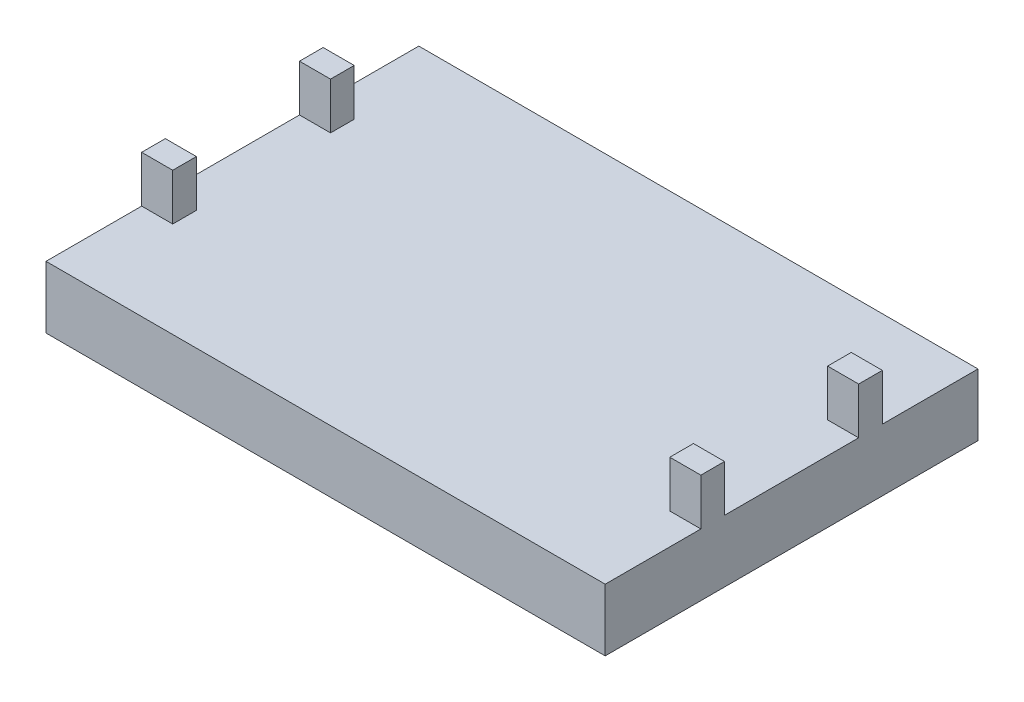
ISO-10303-21;
HEADER;
FILE_DESCRIPTION(('STEP AP214'),'2;1');
FILE_NAME('part.step','',(''),(''),'','','');
FILE_SCHEMA(('AUTOMOTIVE_DESIGN { 1 0 10303 214 1 1 1 1 }'));
ENDSEC;
DATA;
#1=APPLICATION_CONTEXT('core data for automotive mechanical design processes');
#2=APPLICATION_PROTOCOL_DEFINITION('international standard','automotive_design',2000,#1);
#3=PRODUCT_CONTEXT('',#1,'mechanical');
#4=PRODUCT('Part','Part','',(#3));
#5=PRODUCT_RELATED_PRODUCT_CATEGORY('part','',(#4));
#6=PRODUCT_DEFINITION_FORMATION('','',#4);
#7=PRODUCT_DEFINITION_CONTEXT('part definition',#1,'design');
#8=PRODUCT_DEFINITION('design','',#6,#7);
#9=PRODUCT_DEFINITION_SHAPE('','',#8);
#10=(LENGTH_UNIT() NAMED_UNIT(*) SI_UNIT(.MILLI.,.METRE.));
#11=(NAMED_UNIT(*) PLANE_ANGLE_UNIT() SI_UNIT($,.RADIAN.));
#12=(NAMED_UNIT(*) SI_UNIT($,.STERADIAN.) SOLID_ANGLE_UNIT());
#13=UNCERTAINTY_MEASURE_WITH_UNIT(LENGTH_MEASURE(1.E-05),#10,'distance_accuracy_value','');
#14=(GEOMETRIC_REPRESENTATION_CONTEXT(3) GLOBAL_UNCERTAINTY_ASSIGNED_CONTEXT((#13)) GLOBAL_UNIT_ASSIGNED_CONTEXT((#10,
#11,#12)) REPRESENTATION_CONTEXT('',''));
#15=CARTESIAN_POINT('',(0.,0.,0.));
#16=DIRECTION('',(0.,0.,1.));
#17=DIRECTION('',(1.,0.,0.));
#18=AXIS2_PLACEMENT_3D('',#15,#16,#17);
#19=CARTESIAN_POINT('',(0.,10.,0.));
#20=DIRECTION('',(0.,1.,0.));
#21=DIRECTION('',(0.,0.,1.));
#22=AXIS2_PLACEMENT_3D('',#19,#20,#21);
#23=PLANE('',#22);
#24=DIRECTION('',(1.,0.,0.));
#25=VECTOR('',#24,1.);
#26=CARTESIAN_POINT('',(40.,10.,14.605));
#27=LINE('',#26,#25);
#28=CARTESIAN_POINT('',(40.,10.,14.605));
#29=VERTEX_POINT('',#28);
#30=CARTESIAN_POINT('',(45.,10.,14.605));
#31=VERTEX_POINT('',#30);
#32=EDGE_CURVE('E61',#29,#31,#27,.T.);
#33=ORIENTED_EDGE('',*,*,#32,.F.);
#34=DIRECTION('',(0.,0.,-1.));
#35=VECTOR('',#34,1.);
#36=CARTESIAN_POINT('',(40.,10.,0.));
#37=LINE('',#36,#35);
#38=CARTESIAN_POINT('',(40.,10.,10.795));
#39=VERTEX_POINT('',#38);
#40=EDGE_CURVE('E56',#29,#39,#37,.T.);
#41=ORIENTED_EDGE('',*,*,#40,.T.);
#42=DIRECTION('',(1.,0.,0.));
#43=VECTOR('',#42,1.);
#44=CARTESIAN_POINT('',(40.,10.,10.795));
#45=LINE('',#44,#43);
#46=CARTESIAN_POINT('',(45.,10.,10.795));
#47=VERTEX_POINT('',#46);
#48=EDGE_CURVE('E196',#39,#47,#45,.T.);
#49=ORIENTED_EDGE('',*,*,#48,.T.);
#50=DIRECTION('',(0.,0.,-1.));
#51=VECTOR('',#50,1.);
#52=CARTESIAN_POINT('',(45.,10.,30.));
#53=LINE('',#52,#51);
#54=CARTESIAN_POINT('',(45.,10.,-10.795));
#55=VERTEX_POINT('',#54);
#56=EDGE_CURVE('E313',#47,#55,#53,.T.);
#57=ORIENTED_EDGE('',*,*,#56,.T.);
#58=DIRECTION('',(1.,0.,0.));
#59=VECTOR('',#58,1.);
#60=CARTESIAN_POINT('',(40.,10.,-10.795));
#61=LINE('',#60,#59);
#62=CARTESIAN_POINT('',(40.,10.,-10.795));
#63=VERTEX_POINT('',#62);
#64=EDGE_CURVE('E239',#63,#55,#61,.T.);
#65=ORIENTED_EDGE('',*,*,#64,.F.);
#66=DIRECTION('',(0.,0.,-1.));
#67=VECTOR('',#66,1.);
#68=CARTESIAN_POINT('',(40.,10.,0.));
#69=LINE('',#68,#67);
#70=CARTESIAN_POINT('',(40.,10.,-14.605));
#71=VERTEX_POINT('',#70);
#72=EDGE_CURVE('E220',#63,#71,#69,.T.);
#73=ORIENTED_EDGE('',*,*,#72,.T.);
#74=DIRECTION('',(1.,0.,0.));
#75=VECTOR('',#74,1.);
#76=CARTESIAN_POINT('',(40.,10.,-14.605));
#77=LINE('',#76,#75);
#78=CARTESIAN_POINT('',(45.,10.,-14.605));
#79=VERTEX_POINT('',#78);
#80=EDGE_CURVE('E236',#71,#79,#77,.T.);
#81=ORIENTED_EDGE('',*,*,#80,.T.);
#82=CARTESIAN_POINT('',(45.,10.,-30.));
#83=VERTEX_POINT('',#82);
#84=EDGE_CURVE('E309',#79,#83,#53,.T.);
#85=ORIENTED_EDGE('',*,*,#84,.T.);
#86=DIRECTION('',(-1.,0.,0.));
#87=VECTOR('',#86,1.);
#88=CARTESIAN_POINT('',(45.,10.,-30.));
#89=LINE('',#88,#87);
#90=CARTESIAN_POINT('',(-45.,10.,-30.));
#91=VERTEX_POINT('',#90);
#92=EDGE_CURVE('E312',#83,#91,#89,.T.);
#93=ORIENTED_EDGE('',*,*,#92,.T.);
#94=DIRECTION('',(0.,0.,1.));
#95=VECTOR('',#94,1.);
#96=CARTESIAN_POINT('',(-45.,10.,30.));
#97=LINE('',#96,#95);
#98=CARTESIAN_POINT('',(-45.,10.,-14.605));
#99=VERTEX_POINT('',#98);
#100=EDGE_CURVE('E302',#91,#99,#97,.T.);
#101=ORIENTED_EDGE('',*,*,#100,.T.);
#102=DIRECTION('',(-1.,0.,0.));
#103=VECTOR('',#102,1.);
#104=CARTESIAN_POINT('',(-40.,10.,-14.605));
#105=LINE('',#104,#103);
#106=CARTESIAN_POINT('',(-40.,10.,-14.605));
#107=VERTEX_POINT('',#106);
#108=EDGE_CURVE('E299',#107,#99,#105,.T.);
#109=ORIENTED_EDGE('',*,*,#108,.F.);
#110=DIRECTION('',(0.,0.,-1.));
#111=VECTOR('',#110,1.);
#112=CARTESIAN_POINT('',(-40.,10.,0.));
#113=LINE('',#112,#111);
#114=CARTESIAN_POINT('',(-40.,10.,-10.795));
#115=VERTEX_POINT('',#114);
#116=EDGE_CURVE('E281',#115,#107,#113,.T.);
#117=ORIENTED_EDGE('',*,*,#116,.F.);
#118=DIRECTION('',(-1.,0.,0.));
#119=VECTOR('',#118,1.);
#120=CARTESIAN_POINT('',(-40.,10.,-10.795));
#121=LINE('',#120,#119);
#122=CARTESIAN_POINT('',(-45.,10.,-10.795));
#123=VERTEX_POINT('',#122);
#124=EDGE_CURVE('E296',#115,#123,#121,.T.);
#125=ORIENTED_EDGE('',*,*,#124,.T.);
#126=CARTESIAN_POINT('',(-45.,10.,10.795));
#127=VERTEX_POINT('',#126);
#128=EDGE_CURVE('E306',#123,#127,#97,.T.);
#129=ORIENTED_EDGE('',*,*,#128,.T.);
#130=DIRECTION('',(-1.,0.,0.));
#131=VECTOR('',#130,1.);
#132=CARTESIAN_POINT('',(-40.,10.,10.795));
#133=LINE('',#132,#131);
#134=CARTESIAN_POINT('',(-40.,10.,10.795));
#135=VERTEX_POINT('',#134);
#136=EDGE_CURVE('E268',#135,#127,#133,.T.);
#137=ORIENTED_EDGE('',*,*,#136,.F.);
#138=DIRECTION('',(0.,0.,-1.));
#139=VECTOR('',#138,1.);
#140=CARTESIAN_POINT('',(-40.,10.,0.));
#141=LINE('',#140,#139);
#142=CARTESIAN_POINT('',(-40.,10.,14.605));
#143=VERTEX_POINT('',#142);
#144=EDGE_CURVE('E253',#143,#135,#141,.T.);
#145=ORIENTED_EDGE('',*,*,#144,.F.);
#146=DIRECTION('',(-1.,0.,0.));
#147=VECTOR('',#146,1.);
#148=CARTESIAN_POINT('',(-40.,10.,14.605));
#149=LINE('',#148,#147);
#150=CARTESIAN_POINT('',(-45.,10.,14.605));
#151=VERTEX_POINT('',#150);
#152=EDGE_CURVE('E264',#143,#151,#149,.T.);
#153=ORIENTED_EDGE('',*,*,#152,.T.);
#154=CARTESIAN_POINT('',(-45.,10.,30.));
#155=VERTEX_POINT('',#154);
#156=EDGE_CURVE('E307',#151,#155,#97,.T.);
#157=ORIENTED_EDGE('',*,*,#156,.T.);
#158=DIRECTION('',(1.,0.,0.));
#159=VECTOR('',#158,1.);
#160=CARTESIAN_POINT('',(45.,10.,30.));
#161=LINE('',#160,#159);
#162=CARTESIAN_POINT('',(45.,10.,30.));
#163=VERTEX_POINT('',#162);
#164=EDGE_CURVE('E305',#155,#163,#161,.T.);
#165=ORIENTED_EDGE('',*,*,#164,.T.);
#166=EDGE_CURVE('E310',#163,#31,#53,.T.);
#167=ORIENTED_EDGE('',*,*,#166,.T.);
#168=EDGE_LOOP('',(#33,#41,#49,#57,#65,#73,#81,#85,#93,#101,#109,#117,#125,#129,#137,#145,#153,
#157,#165,#167));
#169=FACE_BOUND('',#168,.T.);
#170=ADVANCED_FACE('F41',(#169),#23,.T.);
#171=CARTESIAN_POINT('',(-45.,10.,30.));
#172=DIRECTION('',(1.,0.,0.));
#173=DIRECTION('',(0.,0.,-1.));
#174=AXIS2_PLACEMENT_3D('',#171,#172,#173);
#175=PLANE('',#174);
#176=DIRECTION('',(0.,0.,1.));
#177=VECTOR('',#176,1.);
#178=CARTESIAN_POINT('',(-45.,0.,30.));
#179=LINE('',#178,#177);
#180=CARTESIAN_POINT('',(-45.,0.,-30.));
#181=VERTEX_POINT('',#180);
#182=CARTESIAN_POINT('',(-45.,0.,30.));
#183=VERTEX_POINT('',#182);
#184=EDGE_CURVE('E295',#181,#183,#179,.T.);
#185=ORIENTED_EDGE('',*,*,#184,.T.);
#186=DIRECTION('',(0.,-1.,0.));
#187=VECTOR('',#186,1.);
#188=CARTESIAN_POINT('',(-45.,10.,30.));
#189=LINE('',#188,#187);
#190=EDGE_CURVE('E11',#155,#183,#189,.T.);
#191=ORIENTED_EDGE('',*,*,#190,.F.);
#192=ORIENTED_EDGE('',*,*,#156,.F.);
#193=DIRECTION('',(0.,-1.,0.));
#194=VECTOR('',#193,1.);
#195=CARTESIAN_POINT('',(-45.,0.,14.605));
#196=LINE('',#195,#194);
#197=CARTESIAN_POINT('',(-45.,17.5,14.605));
#198=VERTEX_POINT('',#197);
#199=EDGE_CURVE('E235',#198,#151,#196,.T.);
#200=ORIENTED_EDGE('',*,*,#199,.F.);
#201=DIRECTION('',(0.,0.,-1.));
#202=VECTOR('',#201,1.);
#203=CARTESIAN_POINT('',(-45.,17.5,0.));
#204=LINE('',#203,#202);
#205=CARTESIAN_POINT('',(-45.,17.5,10.795));
#206=VERTEX_POINT('',#205);
#207=EDGE_CURVE('E259',#198,#206,#204,.T.);
#208=ORIENTED_EDGE('',*,*,#207,.T.);
#209=DIRECTION('',(0.,-1.,0.));
#210=VECTOR('',#209,1.);
#211=CARTESIAN_POINT('',(-45.,0.,10.795));
#212=LINE('',#211,#210);
#213=EDGE_CURVE('E247',#206,#127,#212,.T.);
#214=ORIENTED_EDGE('',*,*,#213,.T.);
#215=ORIENTED_EDGE('',*,*,#128,.F.);
#216=DIRECTION('',(0.,-1.,0.));
#217=VECTOR('',#216,1.);
#218=CARTESIAN_POINT('',(-45.,0.,-10.795));
#219=LINE('',#218,#217);
#220=CARTESIAN_POINT('',(-45.,17.5,-10.795));
#221=VERTEX_POINT('',#220);
#222=EDGE_CURVE('E278',#221,#123,#219,.T.);
#223=ORIENTED_EDGE('',*,*,#222,.F.);
#224=DIRECTION('',(0.,0.,1.));
#225=VECTOR('',#224,1.);
#226=CARTESIAN_POINT('',(-45.,17.5,0.));
#227=LINE('',#226,#225);
#228=CARTESIAN_POINT('',(-45.,17.5,-14.605));
#229=VERTEX_POINT('',#228);
#230=EDGE_CURVE('E267',#229,#221,#227,.T.);
#231=ORIENTED_EDGE('',*,*,#230,.F.);
#232=DIRECTION('',(0.,-1.,0.));
#233=VECTOR('',#232,1.);
#234=CARTESIAN_POINT('',(-45.,0.,-14.605));
#235=LINE('',#234,#233);
#236=EDGE_CURVE('E288',#229,#99,#235,.T.);
#237=ORIENTED_EDGE('',*,*,#236,.T.);
#238=ORIENTED_EDGE('',*,*,#100,.F.);
#239=DIRECTION('',(0.,-1.,0.));
#240=VECTOR('',#239,1.);
#241=CARTESIAN_POINT('',(-45.,10.,-30.));
#242=LINE('',#241,#240);
#243=EDGE_CURVE('E315',#91,#181,#242,.T.);
#244=ORIENTED_EDGE('',*,*,#243,.T.);
#245=EDGE_LOOP('',(#185,#191,#192,#200,#208,#214,#215,#223,#231,#237,#238,#244));
#246=FACE_BOUND('',#245,.T.);
#247=ADVANCED_FACE('F43',(#246),#175,.F.);
#248=CARTESIAN_POINT('',(45.,10.,30.));
#249=DIRECTION('',(0.,0.,-1.));
#250=DIRECTION('',(-1.,0.,0.));
#251=AXIS2_PLACEMENT_3D('',#248,#249,#250);
#252=PLANE('',#251);
#253=DIRECTION('',(1.,0.,0.));
#254=VECTOR('',#253,1.);
#255=CARTESIAN_POINT('',(45.,0.,30.));
#256=LINE('',#255,#254);
#257=CARTESIAN_POINT('',(45.,0.,30.));
#258=VERTEX_POINT('',#257);
#259=EDGE_CURVE('E318',#183,#258,#256,.T.);
#260=ORIENTED_EDGE('',*,*,#259,.T.);
#261=DIRECTION('',(0.,-1.,0.));
#262=VECTOR('',#261,1.);
#263=CARTESIAN_POINT('',(45.,10.,30.));
#264=LINE('',#263,#262);
#265=EDGE_CURVE('E49',#163,#258,#264,.T.);
#266=ORIENTED_EDGE('',*,*,#265,.F.);
#267=ORIENTED_EDGE('',*,*,#164,.F.);
#268=ORIENTED_EDGE('',*,*,#190,.T.);
#269=EDGE_LOOP('',(#260,#266,#267,#268));
#270=FACE_BOUND('',#269,.T.);
#271=ADVANCED_FACE('F385',(#270),#252,.F.);
#272=CARTESIAN_POINT('',(45.,10.,30.));
#273=DIRECTION('',(-1.,0.,0.));
#274=DIRECTION('',(0.,0.,1.));
#275=AXIS2_PLACEMENT_3D('',#272,#273,#274);
#276=PLANE('',#275);
#277=DIRECTION('',(0.,0.,-1.));
#278=VECTOR('',#277,1.);
#279=CARTESIAN_POINT('',(45.,0.,30.));
#280=LINE('',#279,#278);
#281=CARTESIAN_POINT('',(45.,0.,-30.));
#282=VERTEX_POINT('',#281);
#283=EDGE_CURVE('E320',#258,#282,#280,.T.);
#284=ORIENTED_EDGE('',*,*,#283,.T.);
#285=DIRECTION('',(0.,-1.,0.));
#286=VECTOR('',#285,1.);
#287=CARTESIAN_POINT('',(45.,10.,-30.));
#288=LINE('',#287,#286);
#289=EDGE_CURVE('E326',#83,#282,#288,.T.);
#290=ORIENTED_EDGE('',*,*,#289,.F.);
#291=ORIENTED_EDGE('',*,*,#84,.F.);
#292=DIRECTION('',(0.,-1.,0.));
#293=VECTOR('',#292,1.);
#294=CARTESIAN_POINT('',(45.,0.,-14.605));
#295=LINE('',#294,#293);
#296=CARTESIAN_POINT('',(45.,17.5,-14.605));
#297=VERTEX_POINT('',#296);
#298=EDGE_CURVE('E217',#297,#79,#295,.T.);
#299=ORIENTED_EDGE('',*,*,#298,.F.);
#300=DIRECTION('',(0.,0.,1.));
#301=VECTOR('',#300,1.);
#302=CARTESIAN_POINT('',(45.,17.5,0.));
#303=LINE('',#302,#301);
#304=CARTESIAN_POINT('',(45.,17.5,-10.795));
#305=VERTEX_POINT('',#304);
#306=EDGE_CURVE('E209',#297,#305,#303,.T.);
#307=ORIENTED_EDGE('',*,*,#306,.T.);
#308=DIRECTION('',(0.,-1.,0.));
#309=VECTOR('',#308,1.);
#310=CARTESIAN_POINT('',(45.,0.,-10.795));
#311=LINE('',#310,#309);
#312=EDGE_CURVE('E228',#305,#55,#311,.T.);
#313=ORIENTED_EDGE('',*,*,#312,.T.);
#314=ORIENTED_EDGE('',*,*,#56,.F.);
#315=DIRECTION('',(0.,-1.,0.));
#316=VECTOR('',#315,1.);
#317=CARTESIAN_POINT('',(45.,0.,10.795));
#318=LINE('',#317,#316);
#319=CARTESIAN_POINT('',(45.,17.5,10.795));
#320=VERTEX_POINT('',#319);
#321=EDGE_CURVE('E206',#320,#47,#318,.T.);
#322=ORIENTED_EDGE('',*,*,#321,.F.);
#323=DIRECTION('',(0.,0.,-1.));
#324=VECTOR('',#323,1.);
#325=CARTESIAN_POINT('',(45.,17.5,0.));
#326=LINE('',#325,#324);
#327=CARTESIAN_POINT('',(45.,17.5,14.605));
#328=VERTEX_POINT('',#327);
#329=EDGE_CURVE('E191',#328,#320,#326,.T.);
#330=ORIENTED_EDGE('',*,*,#329,.F.);
#331=DIRECTION('',(0.,-1.,0.));
#332=VECTOR('',#331,1.);
#333=CARTESIAN_POINT('',(45.,0.,14.605));
#334=LINE('',#333,#332);
#335=EDGE_CURVE('E203',#328,#31,#334,.T.);
#336=ORIENTED_EDGE('',*,*,#335,.T.);
#337=ORIENTED_EDGE('',*,*,#166,.F.);
#338=ORIENTED_EDGE('',*,*,#265,.T.);
#339=EDGE_LOOP('',(#284,#290,#291,#299,#307,#313,#314,#322,#330,#336,#337,#338));
#340=FACE_BOUND('',#339,.T.);
#341=ADVANCED_FACE('F333',(#340),#276,.F.);
#342=CARTESIAN_POINT('',(45.,10.,-30.));
#343=DIRECTION('',(0.,0.,1.));
#344=DIRECTION('',(1.,0.,0.));
#345=AXIS2_PLACEMENT_3D('',#342,#343,#344);
#346=PLANE('',#345);
#347=DIRECTION('',(-1.,0.,0.));
#348=VECTOR('',#347,1.);
#349=CARTESIAN_POINT('',(45.,0.,-30.));
#350=LINE('',#349,#348);
#351=EDGE_CURVE('E322',#282,#181,#350,.T.);
#352=ORIENTED_EDGE('',*,*,#351,.T.);
#353=ORIENTED_EDGE('',*,*,#243,.F.);
#354=ORIENTED_EDGE('',*,*,#92,.F.);
#355=ORIENTED_EDGE('',*,*,#289,.T.);
#356=EDGE_LOOP('',(#352,#353,#354,#355));
#357=FACE_BOUND('',#356,.T.);
#358=ADVANCED_FACE('F343',(#357),#346,.F.);
#359=CARTESIAN_POINT('',(0.,0.,0.));
#360=DIRECTION('',(0.,1.,0.));
#361=DIRECTION('',(0.,0.,1.));
#362=AXIS2_PLACEMENT_3D('',#359,#360,#361);
#363=PLANE('',#362);
#364=ORIENTED_EDGE('',*,*,#184,.F.);
#365=ORIENTED_EDGE('',*,*,#351,.F.);
#366=ORIENTED_EDGE('',*,*,#283,.F.);
#367=ORIENTED_EDGE('',*,*,#259,.F.);
#368=EDGE_LOOP('',(#364,#365,#366,#367));
#369=FACE_BOUND('',#368,.T.);
#370=ADVANCED_FACE('F340',(#369),#363,.F.);
#371=CARTESIAN_POINT('',(-40.,17.5,0.));
#372=DIRECTION('',(0.,-1.,0.));
#373=DIRECTION('',(0.,0.,-1.));
#374=AXIS2_PLACEMENT_3D('',#371,#372,#373);
#375=PLANE('',#374);
#376=ORIENTED_EDGE('',*,*,#230,.T.);
#377=DIRECTION('',(-1.,0.,0.));
#378=VECTOR('',#377,1.);
#379=CARTESIAN_POINT('',(-40.,17.5,-10.795));
#380=LINE('',#379,#378);
#381=CARTESIAN_POINT('',(-40.,17.5,-10.795));
#382=VERTEX_POINT('',#381);
#383=EDGE_CURVE('E292',#382,#221,#380,.T.);
#384=ORIENTED_EDGE('',*,*,#383,.F.);
#385=DIRECTION('',(0.,0.,1.));
#386=VECTOR('',#385,1.);
#387=CARTESIAN_POINT('',(-40.,17.5,0.));
#388=LINE('',#387,#386);
#389=CARTESIAN_POINT('',(-40.,17.5,-14.605));
#390=VERTEX_POINT('',#389);
#391=EDGE_CURVE('E274',#390,#382,#388,.T.);
#392=ORIENTED_EDGE('',*,*,#391,.F.);
#393=DIRECTION('',(-1.,0.,0.));
#394=VECTOR('',#393,1.);
#395=CARTESIAN_POINT('',(-40.,17.5,-14.605));
#396=LINE('',#395,#394);
#397=EDGE_CURVE('E285',#390,#229,#396,.T.);
#398=ORIENTED_EDGE('',*,*,#397,.T.);
#399=EDGE_LOOP('',(#376,#384,#392,#398));
#400=FACE_BOUND('',#399,.T.);
#401=ADVANCED_FACE('F388',(#400),#375,.F.);
#402=CARTESIAN_POINT('',(-40.,0.,-10.795));
#403=DIRECTION('',(0.,0.,-1.));
#404=DIRECTION('',(0.,1.,0.));
#405=AXIS2_PLACEMENT_3D('',#402,#403,#404);
#406=PLANE('',#405);
#407=ORIENTED_EDGE('',*,*,#222,.T.);
#408=ORIENTED_EDGE('',*,*,#124,.F.);
#409=DIRECTION('',(0.,-1.,0.));
#410=VECTOR('',#409,1.);
#411=CARTESIAN_POINT('',(-40.,0.,-10.795));
#412=LINE('',#411,#410);
#413=EDGE_CURVE('E283',#382,#115,#412,.T.);
#414=ORIENTED_EDGE('',*,*,#413,.F.);
#415=ORIENTED_EDGE('',*,*,#383,.T.);
#416=EDGE_LOOP('',(#407,#408,#414,#415));
#417=FACE_BOUND('',#416,.T.);
#418=ADVANCED_FACE('F427',(#417),#406,.F.);
#419=CARTESIAN_POINT('',(-40.,0.,-14.605));
#420=DIRECTION('',(0.,0.,-1.));
#421=DIRECTION('',(0.,1.,0.));
#422=AXIS2_PLACEMENT_3D('',#419,#420,#421);
#423=PLANE('',#422);
#424=ORIENTED_EDGE('',*,*,#236,.F.);
#425=ORIENTED_EDGE('',*,*,#397,.F.);
#426=DIRECTION('',(0.,-1.,0.));
#427=VECTOR('',#426,1.);
#428=CARTESIAN_POINT('',(-40.,0.,-14.605));
#429=LINE('',#428,#427);
#430=EDGE_CURVE('E277',#390,#107,#429,.T.);
#431=ORIENTED_EDGE('',*,*,#430,.T.);
#432=ORIENTED_EDGE('',*,*,#108,.T.);
#433=EDGE_LOOP('',(#424,#425,#431,#432));
#434=FACE_BOUND('',#433,.T.);
#435=ADVANCED_FACE('F425',(#434),#423,.T.);
#436=CARTESIAN_POINT('',(-40.,0.,0.));
#437=DIRECTION('',(-1.,0.,0.));
#438=DIRECTION('',(0.,0.,1.));
#439=AXIS2_PLACEMENT_3D('',#436,#437,#438);
#440=PLANE('',#439);
#441=ORIENTED_EDGE('',*,*,#391,.T.);
#442=ORIENTED_EDGE('',*,*,#413,.T.);
#443=ORIENTED_EDGE('',*,*,#116,.T.);
#444=ORIENTED_EDGE('',*,*,#430,.F.);
#445=EDGE_LOOP('',(#441,#442,#443,#444));
#446=FACE_BOUND('',#445,.T.);
#447=ADVANCED_FACE('F422',(#446),#440,.F.);
#448=CARTESIAN_POINT('',(-40.,0.,14.605));
#449=DIRECTION('',(0.,0.,-1.));
#450=DIRECTION('',(-1.,0.,0.));
#451=AXIS2_PLACEMENT_3D('',#448,#449,#450);
#452=PLANE('',#451);
#453=ORIENTED_EDGE('',*,*,#199,.T.);
#454=ORIENTED_EDGE('',*,*,#152,.F.);
#455=DIRECTION('',(0.,-1.,0.));
#456=VECTOR('',#455,1.);
#457=CARTESIAN_POINT('',(-40.,0.,14.605));
#458=LINE('',#457,#456);
#459=CARTESIAN_POINT('',(-40.,17.5,14.605));
#460=VERTEX_POINT('',#459);
#461=EDGE_CURVE('E243',#460,#143,#458,.T.);
#462=ORIENTED_EDGE('',*,*,#461,.F.);
#463=DIRECTION('',(-1.,0.,0.));
#464=VECTOR('',#463,1.);
#465=CARTESIAN_POINT('',(-40.,17.5,14.605));
#466=LINE('',#465,#464);
#467=EDGE_CURVE('E256',#460,#198,#466,.T.);
#468=ORIENTED_EDGE('',*,*,#467,.T.);
#469=EDGE_LOOP('',(#453,#454,#462,#468));
#470=FACE_BOUND('',#469,.T.);
#471=ADVANCED_FACE('F402',(#470),#452,.F.);
#472=CARTESIAN_POINT('',(-40.,0.,10.795));
#473=DIRECTION('',(0.,0.,-1.));
#474=DIRECTION('',(-1.,0.,0.));
#475=AXIS2_PLACEMENT_3D('',#472,#473,#474);
#476=PLANE('',#475);
#477=ORIENTED_EDGE('',*,*,#213,.F.);
#478=DIRECTION('',(-1.,0.,0.));
#479=VECTOR('',#478,1.);
#480=CARTESIAN_POINT('',(-40.,17.5,10.795));
#481=LINE('',#480,#479);
#482=CARTESIAN_POINT('',(-40.,17.5,10.795));
#483=VERTEX_POINT('',#482);
#484=EDGE_CURVE('E271',#483,#206,#481,.T.);
#485=ORIENTED_EDGE('',*,*,#484,.F.);
#486=DIRECTION('',(0.,-1.,0.));
#487=VECTOR('',#486,1.);
#488=CARTESIAN_POINT('',(-40.,0.,10.795));
#489=LINE('',#488,#487);
#490=EDGE_CURVE('E250',#483,#135,#489,.T.);
#491=ORIENTED_EDGE('',*,*,#490,.T.);
#492=ORIENTED_EDGE('',*,*,#136,.T.);
#493=EDGE_LOOP('',(#477,#485,#491,#492));
#494=FACE_BOUND('',#493,.T.);
#495=ADVANCED_FACE('F409',(#494),#476,.T.);
#496=CARTESIAN_POINT('',(-40.,17.5,0.));
#497=DIRECTION('',(0.,1.,0.));
#498=DIRECTION('',(0.,0.,1.));
#499=AXIS2_PLACEMENT_3D('',#496,#497,#498);
#500=PLANE('',#499);
#501=ORIENTED_EDGE('',*,*,#207,.F.);
#502=ORIENTED_EDGE('',*,*,#467,.F.);
#503=DIRECTION('',(0.,0.,-1.));
#504=VECTOR('',#503,1.);
#505=CARTESIAN_POINT('',(-40.,17.5,0.));
#506=LINE('',#505,#504);
#507=EDGE_CURVE('E246',#460,#483,#506,.T.);
#508=ORIENTED_EDGE('',*,*,#507,.T.);
#509=ORIENTED_EDGE('',*,*,#484,.T.);
#510=EDGE_LOOP('',(#501,#502,#508,#509));
#511=FACE_BOUND('',#510,.T.);
#512=ADVANCED_FACE('F405',(#511),#500,.T.);
#513=CARTESIAN_POINT('',(-40.,0.,0.));
#514=DIRECTION('',(-1.,0.,0.));
#515=DIRECTION('',(0.,0.,1.));
#516=AXIS2_PLACEMENT_3D('',#513,#514,#515);
#517=PLANE('',#516);
#518=ORIENTED_EDGE('',*,*,#461,.T.);
#519=ORIENTED_EDGE('',*,*,#144,.T.);
#520=ORIENTED_EDGE('',*,*,#490,.F.);
#521=ORIENTED_EDGE('',*,*,#507,.F.);
#522=EDGE_LOOP('',(#518,#519,#520,#521));
#523=FACE_BOUND('',#522,.T.);
#524=ADVANCED_FACE('F375',(#523),#517,.F.);
#525=CARTESIAN_POINT('',(40.,17.5,0.));
#526=DIRECTION('',(0.,1.,0.));
#527=DIRECTION('',(0.,0.,1.));
#528=AXIS2_PLACEMENT_3D('',#525,#526,#527);
#529=PLANE('',#528);
#530=ORIENTED_EDGE('',*,*,#306,.F.);
#531=DIRECTION('',(1.,0.,0.));
#532=VECTOR('',#531,1.);
#533=CARTESIAN_POINT('',(40.,17.5,-14.605));
#534=LINE('',#533,#532);
#535=CARTESIAN_POINT('',(40.,17.5,-14.605));
#536=VERTEX_POINT('',#535);
#537=EDGE_CURVE('E233',#536,#297,#534,.T.);
#538=ORIENTED_EDGE('',*,*,#537,.F.);
#539=DIRECTION('',(0.,0.,1.));
#540=VECTOR('',#539,1.);
#541=CARTESIAN_POINT('',(40.,17.5,0.));
#542=LINE('',#541,#540);
#543=CARTESIAN_POINT('',(40.,17.5,-10.795));
#544=VERTEX_POINT('',#543);
#545=EDGE_CURVE('E213',#536,#544,#542,.T.);
#546=ORIENTED_EDGE('',*,*,#545,.T.);
#547=DIRECTION('',(1.,0.,0.));
#548=VECTOR('',#547,1.);
#549=CARTESIAN_POINT('',(40.,17.5,-10.795));
#550=LINE('',#549,#548);
#551=EDGE_CURVE('E225',#544,#305,#550,.T.);
#552=ORIENTED_EDGE('',*,*,#551,.T.);
#553=EDGE_LOOP('',(#530,#538,#546,#552));
#554=FACE_BOUND('',#553,.T.);
#555=ADVANCED_FACE('F361',(#554),#529,.T.);
#556=CARTESIAN_POINT('',(40.,0.,-14.605));
#557=DIRECTION('',(0.,0.,1.));
#558=DIRECTION('',(0.,-1.,0.));
#559=AXIS2_PLACEMENT_3D('',#556,#557,#558);
#560=PLANE('',#559);
#561=ORIENTED_EDGE('',*,*,#298,.T.);
#562=ORIENTED_EDGE('',*,*,#80,.F.);
#563=DIRECTION('',(0.,-1.,0.));
#564=VECTOR('',#563,1.);
#565=CARTESIAN_POINT('',(40.,0.,-14.605));
#566=LINE('',#565,#564);
#567=EDGE_CURVE('E222',#536,#71,#566,.T.);
#568=ORIENTED_EDGE('',*,*,#567,.F.);
#569=ORIENTED_EDGE('',*,*,#537,.T.);
#570=EDGE_LOOP('',(#561,#562,#568,#569));
#571=FACE_BOUND('',#570,.T.);
#572=ADVANCED_FACE('F367',(#571),#560,.F.);
#573=CARTESIAN_POINT('',(40.,0.,-10.795));
#574=DIRECTION('',(0.,0.,1.));
#575=DIRECTION('',(0.,-1.,0.));
#576=AXIS2_PLACEMENT_3D('',#573,#574,#575);
#577=PLANE('',#576);
#578=ORIENTED_EDGE('',*,*,#312,.F.);
#579=ORIENTED_EDGE('',*,*,#551,.F.);
#580=DIRECTION('',(0.,-1.,0.));
#581=VECTOR('',#580,1.);
#582=CARTESIAN_POINT('',(40.,0.,-10.795));
#583=LINE('',#582,#581);
#584=EDGE_CURVE('E216',#544,#63,#583,.T.);
#585=ORIENTED_EDGE('',*,*,#584,.T.);
#586=ORIENTED_EDGE('',*,*,#64,.T.);
#587=EDGE_LOOP('',(#578,#579,#585,#586));
#588=FACE_BOUND('',#587,.T.);
#589=ADVANCED_FACE('F357',(#588),#577,.T.);
#590=CARTESIAN_POINT('',(40.,0.,0.));
#591=DIRECTION('',(1.,0.,0.));
#592=DIRECTION('',(0.,0.,1.));
#593=AXIS2_PLACEMENT_3D('',#590,#591,#592);
#594=PLANE('',#593);
#595=ORIENTED_EDGE('',*,*,#545,.F.);
#596=ORIENTED_EDGE('',*,*,#567,.T.);
#597=ORIENTED_EDGE('',*,*,#72,.F.);
#598=ORIENTED_EDGE('',*,*,#584,.F.);
#599=EDGE_LOOP('',(#595,#596,#597,#598));
#600=FACE_BOUND('',#599,.T.);
#601=ADVANCED_FACE('F365',(#600),#594,.F.);
#602=CARTESIAN_POINT('',(40.,0.,14.605));
#603=DIRECTION('',(0.,0.,1.));
#604=DIRECTION('',(1.,0.,0.));
#605=AXIS2_PLACEMENT_3D('',#602,#603,#604);
#606=PLANE('',#605);
#607=ORIENTED_EDGE('',*,*,#335,.F.);
#608=DIRECTION('',(1.,0.,0.));
#609=VECTOR('',#608,1.);
#610=CARTESIAN_POINT('',(40.,17.5,14.605));
#611=LINE('',#610,#609);
#612=CARTESIAN_POINT('',(40.,17.5,14.605));
#613=VERTEX_POINT('',#612);
#614=EDGE_CURVE('E195',#613,#328,#611,.T.);
#615=ORIENTED_EDGE('',*,*,#614,.F.);
#616=DIRECTION('',(0.,-1.,0.));
#617=VECTOR('',#616,1.);
#618=CARTESIAN_POINT('',(40.,0.,14.605));
#619=LINE('',#618,#617);
#620=EDGE_CURVE('E184',#613,#29,#619,.T.);
#621=ORIENTED_EDGE('',*,*,#620,.T.);
#622=ORIENTED_EDGE('',*,*,#32,.T.);
#623=EDGE_LOOP('',(#607,#615,#621,#622));
#624=FACE_BOUND('',#623,.T.);
#625=ADVANCED_FACE('F520',(#624),#606,.T.);
#626=CARTESIAN_POINT('',(40.,17.5,0.));
#627=DIRECTION('',(0.,-1.,0.));
#628=DIRECTION('',(0.,0.,-1.));
#629=AXIS2_PLACEMENT_3D('',#626,#627,#628);
#630=PLANE('',#629);
#631=ORIENTED_EDGE('',*,*,#329,.T.);
#632=DIRECTION('',(1.,0.,0.));
#633=VECTOR('',#632,1.);
#634=CARTESIAN_POINT('',(40.,17.5,10.795));
#635=LINE('',#634,#633);
#636=CARTESIAN_POINT('',(40.,17.5,10.795));
#637=VERTEX_POINT('',#636);
#638=EDGE_CURVE('E188',#637,#320,#635,.T.);
#639=ORIENTED_EDGE('',*,*,#638,.F.);
#640=DIRECTION('',(0.,0.,-1.));
#641=VECTOR('',#640,1.);
#642=CARTESIAN_POINT('',(40.,17.5,0.));
#643=LINE('',#642,#641);
#644=EDGE_CURVE('E177',#613,#637,#643,.T.);
#645=ORIENTED_EDGE('',*,*,#644,.F.);
#646=ORIENTED_EDGE('',*,*,#614,.T.);
#647=EDGE_LOOP('',(#631,#639,#645,#646));
#648=FACE_BOUND('',#647,.T.);
#649=ADVANCED_FACE('F189',(#648),#630,.F.);
#650=CARTESIAN_POINT('',(40.,0.,10.795));
#651=DIRECTION('',(0.,0.,1.));
#652=DIRECTION('',(1.,0.,0.));
#653=AXIS2_PLACEMENT_3D('',#650,#651,#652);
#654=PLANE('',#653);
#655=ORIENTED_EDGE('',*,*,#321,.T.);
#656=ORIENTED_EDGE('',*,*,#48,.F.);
#657=DIRECTION('',(0.,-1.,0.));
#658=VECTOR('',#657,1.);
#659=CARTESIAN_POINT('',(40.,0.,10.795));
#660=LINE('',#659,#658);
#661=EDGE_CURVE('E181',#637,#39,#660,.T.);
#662=ORIENTED_EDGE('',*,*,#661,.F.);
#663=ORIENTED_EDGE('',*,*,#638,.T.);
#664=EDGE_LOOP('',(#655,#656,#662,#663));
#665=FACE_BOUND('',#664,.T.);
#666=ADVANCED_FACE('F198',(#665),#654,.F.);
#667=CARTESIAN_POINT('',(40.,0.,0.));
#668=DIRECTION('',(1.,0.,0.));
#669=DIRECTION('',(0.,0.,1.));
#670=AXIS2_PLACEMENT_3D('',#667,#668,#669);
#671=PLANE('',#670);
#672=ORIENTED_EDGE('',*,*,#620,.F.);
#673=ORIENTED_EDGE('',*,*,#644,.T.);
#674=ORIENTED_EDGE('',*,*,#661,.T.);
#675=ORIENTED_EDGE('',*,*,#40,.F.);
#676=EDGE_LOOP('',(#672,#673,#674,#675));
#677=FACE_BOUND('',#676,.T.);
#678=ADVANCED_FACE('F179',(#677),#671,.F.);
#679=CLOSED_SHELL('',(#170,#247,#271,#341,#358,#370,#401,#418,#435,#447,#471,#495,#512,#524,
#555,#572,#589,#601,#625,#649,#666,#678));
#680=MANIFOLD_SOLID_BREP('B2',#679);
#681=ADVANCED_BREP_SHAPE_REPRESENTATION('',(#18,#680),#14);
#682=SHAPE_DEFINITION_REPRESENTATION(#9,#681);
ENDSEC;
END-ISO-10303-21;
